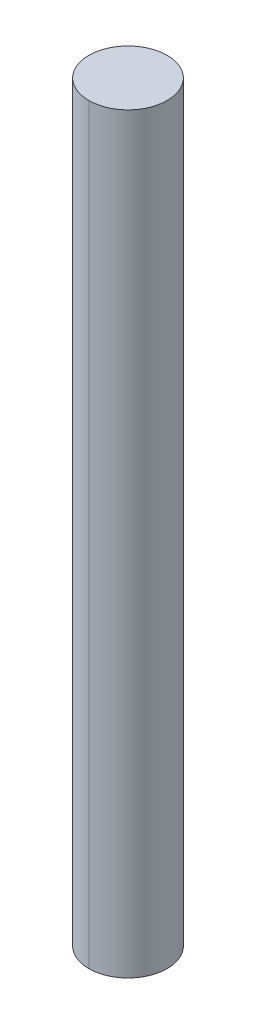
ISO-10303-21;
HEADER;
FILE_DESCRIPTION(('STEP AP214'),'2;1');
FILE_NAME('part.step','',(''),(''),'','','');
FILE_SCHEMA(('AUTOMOTIVE_DESIGN { 1 0 10303 214 1 1 1 1 }'));
ENDSEC;
DATA;
#1=APPLICATION_CONTEXT('core data for automotive mechanical design processes');
#2=APPLICATION_PROTOCOL_DEFINITION('international standard','automotive_design',2000,#1);
#3=PRODUCT_CONTEXT('',#1,'mechanical');
#4=PRODUCT('Part','Part','',(#3));
#5=PRODUCT_RELATED_PRODUCT_CATEGORY('part','',(#4));
#6=PRODUCT_DEFINITION_FORMATION('','',#4);
#7=PRODUCT_DEFINITION_CONTEXT('part definition',#1,'design');
#8=PRODUCT_DEFINITION('design','',#6,#7);
#9=PRODUCT_DEFINITION_SHAPE('','',#8);
#10=(LENGTH_UNIT() NAMED_UNIT(*) SI_UNIT(.MILLI.,.METRE.));
#11=(NAMED_UNIT(*) PLANE_ANGLE_UNIT() SI_UNIT($,.RADIAN.));
#12=(NAMED_UNIT(*) SI_UNIT($,.STERADIAN.) SOLID_ANGLE_UNIT());
#13=UNCERTAINTY_MEASURE_WITH_UNIT(LENGTH_MEASURE(1.E-05),#10,'distance_accuracy_value','');
#14=(GEOMETRIC_REPRESENTATION_CONTEXT(3) GLOBAL_UNCERTAINTY_ASSIGNED_CONTEXT((#13)) GLOBAL_UNIT_ASSIGNED_CONTEXT((#10,
#11,#12)) REPRESENTATION_CONTEXT('',''));
#15=CARTESIAN_POINT('',(0.,0.,0.));
#16=DIRECTION('',(0.,0.,1.));
#17=DIRECTION('',(1.,0.,0.));
#18=AXIS2_PLACEMENT_3D('',#15,#16,#17);
#19=CARTESIAN_POINT('',(0.,0.,0.));
#20=DIRECTION('',(0.,1.,0.));
#21=DIRECTION('',(1.,0.,0.));
#22=AXIS2_PLACEMENT_3D('',#19,#20,#21);
#23=PLANE('',#22);
#24=CARTESIAN_POINT('',(0.,0.,0.));
#25=DIRECTION('',(0.,1.,0.));
#26=DIRECTION('',(0.,0.,1.));
#27=AXIS2_PLACEMENT_3D('',#24,#25,#26);
#28=CIRCLE('',#27,0.625);
#29=CARTESIAN_POINT('',(0.,0.,-0.625));
#30=VERTEX_POINT('',#29);
#31=CARTESIAN_POINT('',(0.,0.,0.625));
#32=VERTEX_POINT('',#31);
#33=EDGE_CURVE('E11',#30,#32,#28,.T.);
#34=ORIENTED_EDGE('',*,*,#33,.F.);
#35=CARTESIAN_POINT('',(0.,0.,0.));
#36=DIRECTION('',(0.,1.,0.));
#37=DIRECTION('',(0.,0.,1.));
#38=AXIS2_PLACEMENT_3D('',#35,#36,#37);
#39=CIRCLE('',#38,0.625);
#40=EDGE_CURVE('E67',#32,#30,#39,.T.);
#41=ORIENTED_EDGE('',*,*,#40,.F.);
#42=EDGE_LOOP('',(#34,#41));
#43=FACE_BOUND('',#42,.T.);
#44=ADVANCED_FACE('F17',(#43),#23,.F.);
#45=CARTESIAN_POINT('',(0.,12.,0.));
#46=DIRECTION('',(0.,1.,0.));
#47=DIRECTION('',(1.,0.,0.));
#48=AXIS2_PLACEMENT_3D('',#45,#46,#47);
#49=PLANE('',#48);
#50=CARTESIAN_POINT('',(0.,12.,0.));
#51=DIRECTION('',(0.,1.,0.));
#52=DIRECTION('',(0.,0.,1.));
#53=AXIS2_PLACEMENT_3D('',#50,#51,#52);
#54=CIRCLE('',#53,0.625);
#55=CARTESIAN_POINT('',(0.,12.,-0.625));
#56=VERTEX_POINT('',#55);
#57=CARTESIAN_POINT('',(0.,12.,0.625));
#58=VERTEX_POINT('',#57);
#59=EDGE_CURVE('E25',#56,#58,#54,.T.);
#60=ORIENTED_EDGE('',*,*,#59,.T.);
#61=CARTESIAN_POINT('',(0.,12.,0.));
#62=DIRECTION('',(0.,1.,0.));
#63=DIRECTION('',(0.,0.,1.));
#64=AXIS2_PLACEMENT_3D('',#61,#62,#63);
#65=CIRCLE('',#64,0.625);
#66=EDGE_CURVE('E56',#58,#56,#65,.T.);
#67=ORIENTED_EDGE('',*,*,#66,.T.);
#68=EDGE_LOOP('',(#60,#67));
#69=FACE_BOUND('',#68,.T.);
#70=ADVANCED_FACE('F54',(#69),#49,.T.);
#71=CARTESIAN_POINT('',(0.,12.,0.));
#72=DIRECTION('',(0.,-1.,0.));
#73=DIRECTION('',(0.,0.,-1.));
#74=AXIS2_PLACEMENT_3D('',#71,#72,#73);
#75=CYLINDRICAL_SURFACE('',#74,0.625);
#76=DIRECTION('',(0.,-1.,0.));
#77=VECTOR('',#76,1.);
#78=CARTESIAN_POINT('',(0.,12.,0.625));
#79=LINE('',#78,#77);
#80=EDGE_CURVE('E62',#58,#32,#79,.T.);
#81=ORIENTED_EDGE('',*,*,#80,.F.);
#82=ORIENTED_EDGE('',*,*,#59,.F.);
#83=DIRECTION('',(0.,-1.,0.));
#84=VECTOR('',#83,1.);
#85=CARTESIAN_POINT('',(0.,12.,-0.625));
#86=LINE('',#85,#84);
#87=EDGE_CURVE('E59',#56,#30,#86,.T.);
#88=ORIENTED_EDGE('',*,*,#87,.T.);
#89=ORIENTED_EDGE('',*,*,#33,.T.);
#90=EDGE_LOOP('',(#81,#82,#88,#89));
#91=FACE_BOUND('',#90,.T.);
#92=ADVANCED_FACE('F63',(#91),#75,.T.);
#93=CARTESIAN_POINT('',(0.,12.,0.));
#94=DIRECTION('',(0.,-1.,0.));
#95=DIRECTION('',(0.,0.,-1.));
#96=AXIS2_PLACEMENT_3D('',#93,#94,#95);
#97=CYLINDRICAL_SURFACE('',#96,0.625);
#98=ORIENTED_EDGE('',*,*,#66,.F.);
#99=ORIENTED_EDGE('',*,*,#80,.T.);
#100=ORIENTED_EDGE('',*,*,#40,.T.);
#101=ORIENTED_EDGE('',*,*,#87,.F.);
#102=EDGE_LOOP('',(#98,#99,#100,#101));
#103=FACE_BOUND('',#102,.T.);
#104=ADVANCED_FACE('F69',(#103),#97,.T.);
#105=CLOSED_SHELL('',(#44,#70,#92,#104));
#106=MANIFOLD_SOLID_BREP('B1',#105);
#107=ADVANCED_BREP_SHAPE_REPRESENTATION('',(#18,#106),#14);
#108=SHAPE_DEFINITION_REPRESENTATION(#9,#107);
ENDSEC;
END-ISO-10303-21;
